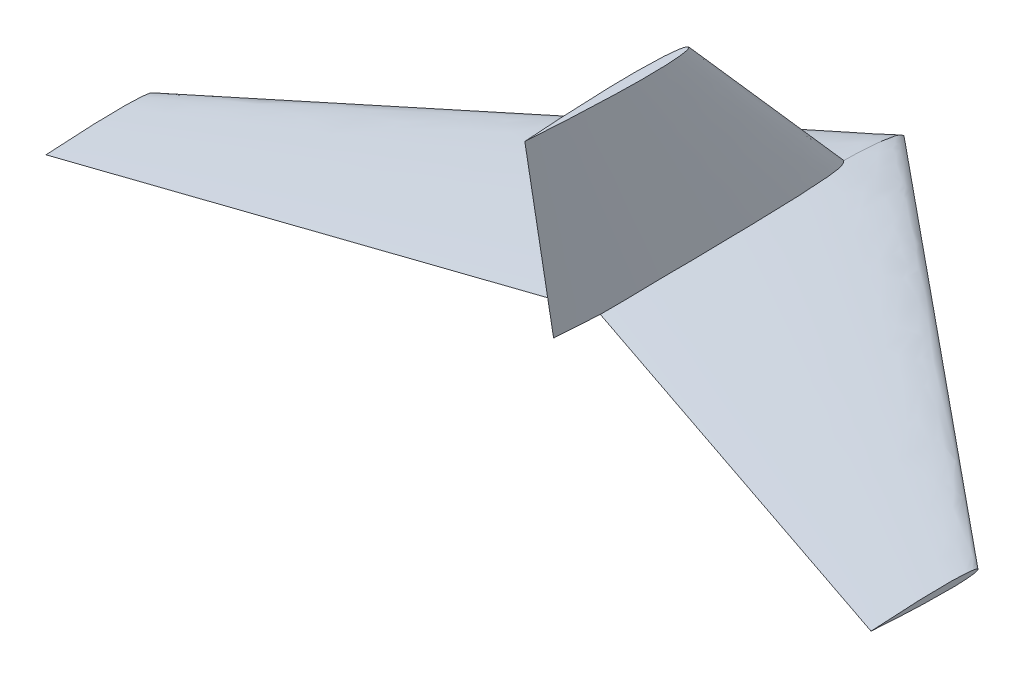
ISO-10303-21;
HEADER;
FILE_DESCRIPTION(('STEP AP214'),'2;1');
FILE_NAME('part.step','',(''),(''),'','','');
FILE_SCHEMA(('AUTOMOTIVE_DESIGN { 1 0 10303 214 1 1 1 1 }'));
ENDSEC;
DATA;
#1=APPLICATION_CONTEXT('core data for automotive mechanical design processes');
#2=APPLICATION_PROTOCOL_DEFINITION('international standard','automotive_design',2000,#1);
#3=PRODUCT_CONTEXT('',#1,'mechanical');
#4=PRODUCT('Part','Part','',(#3));
#5=PRODUCT_RELATED_PRODUCT_CATEGORY('part','',(#4));
#6=PRODUCT_DEFINITION_FORMATION('','',#4);
#7=PRODUCT_DEFINITION_CONTEXT('part definition',#1,'design');
#8=PRODUCT_DEFINITION('design','',#6,#7);
#9=PRODUCT_DEFINITION_SHAPE('','',#8);
#10=(LENGTH_UNIT() NAMED_UNIT(*) SI_UNIT(.MILLI.,.METRE.));
#11=(NAMED_UNIT(*) PLANE_ANGLE_UNIT() SI_UNIT($,.RADIAN.));
#12=(NAMED_UNIT(*) SI_UNIT($,.STERADIAN.) SOLID_ANGLE_UNIT());
#13=UNCERTAINTY_MEASURE_WITH_UNIT(LENGTH_MEASURE(1.E-05),#10,'distance_accuracy_value','');
#14=(GEOMETRIC_REPRESENTATION_CONTEXT(3) GLOBAL_UNCERTAINTY_ASSIGNED_CONTEXT((#13)) GLOBAL_UNIT_ASSIGNED_CONTEXT((#10,
#11,#12)) REPRESENTATION_CONTEXT('',''));
#15=CARTESIAN_POINT('',(0.,0.,0.));
#16=DIRECTION('',(0.,0.,1.));
#17=DIRECTION('',(1.,0.,0.));
#18=AXIS2_PLACEMENT_3D('',#15,#16,#17);
#19=CARTESIAN_POINT('',(90.2729964394559,0.,2285.86063175467));
#20=DIRECTION('',(0.,1.,0.));
#21=DIRECTION('',(0.,0.,1.));
#22=AXIS2_PLACEMENT_3D('',#19,#20,#21);
#23=PLANE('',#22);
#24=CARTESIAN_POINT('',(0.,0.,597.375777228107));
#25=CARTESIAN_POINT('',(24.4686857432572,0.,623.99082207803));
#26=CARTESIAN_POINT('',(48.0807674286761,0.,676.749943253216));
#27=CARTESIAN_POINT('',(58.4563941885563,0.,740.497070586776));
#28=CARTESIAN_POINT('',(67.0356181046043,0.,798.221641109859));
#29=CARTESIAN_POINT('',(71.6619113970218,0.,833.954531447695));
#30=CARTESIAN_POINT('',(76.7954611532741,0.,885.556528213105));
#31=CARTESIAN_POINT('',(78.7254432911088,0.,910.476862048081));
#32=CARTESIAN_POINT('',(84.9692734153363,0.,993.647536772071));
#33=CARTESIAN_POINT('',(89.4514630302663,0.,1059.05275127144));
#34=CARTESIAN_POINT('',(95.1214122712025,0.,1171.66484206801));
#35=CARTESIAN_POINT('',(97.0349702142618,0.,1224.59310122597));
#36=CARTESIAN_POINT('',(101.528355475328,0.,1386.08407254535));
#37=CARTESIAN_POINT('',(102.502084377375,0.,1500.16944808936));
#38=CARTESIAN_POINT('',(101.978691915586,0.,1839.41623870926));
#39=CARTESIAN_POINT('',(94.6250607128276,0.,2178.97783262625));
#40=CARTESIAN_POINT('',(66.4940356116456,0.,2970.17291405463));
#41=CARTESIAN_POINT('',(33.6189798191377,0.,3535.06648153273));
#42=CARTESIAN_POINT('',(0.,0.,3986.5467473708));
#43=B_SPLINE_CURVE_WITH_KNOTS('',3,(#24,#25,#26,#27,#28,#29,#30,#31,#32,#33,#34,#35,#36,#37,#38,
#39,#40,#41,#42),.UNSPECIFIED.,.F.,.F.,(4,1,1,1,1,1,1,1,1,1,1,1,1,1,1,1,4),(0.,
0.0297059101390745,0.0510978464013305,0.0565098822415303,0.0809910879672366,0.0828811165702095,
0.102210307338613,0.102991859394858,0.156309200171479,0.159955868882718,0.20230384136123,
0.202946576893144,0.3022274459203,0.302770782723327,0.501714656703684,0.601307692969157,1.),.UNSPECIFIED.);
#44=CARTESIAN_POINT('',(0.,0.,3986.5467473708));
#45=VERTEX_POINT('',#44);
#46=CARTESIAN_POINT('',(0.,0.,597.375777228107));
#47=VERTEX_POINT('',#46);
#48=EDGE_CURVE('E93',#45,#47,#43,.F.);
#49=ORIENTED_EDGE('',*,*,#48,.F.);
#50=CARTESIAN_POINT('',(0.,0.,3986.5467473708));
#51=CARTESIAN_POINT('',(-33.6189798191371,0.,3535.06648153273));
#52=CARTESIAN_POINT('',(-66.494035611645,0.,2970.17291405463));
#53=CARTESIAN_POINT('',(-94.6250607128273,0.,2178.97783262625));
#54=CARTESIAN_POINT('',(-101.978691915586,0.,1839.41623870926));
#55=CARTESIAN_POINT('',(-102.502084377375,0.,1500.16944808936));
#56=CARTESIAN_POINT('',(-101.528355475328,0.,1386.08407254535));
#57=CARTESIAN_POINT('',(-97.0349702142617,0.,1224.59310122597));
#58=CARTESIAN_POINT('',(-95.1214122712025,0.,1171.66484206801));
#59=CARTESIAN_POINT('',(-89.4514630302662,0.,1059.05275127144));
#60=CARTESIAN_POINT('',(-84.9692734153364,0.,993.647536772071));
#61=CARTESIAN_POINT('',(-78.7254432911088,0.,910.476862048081));
#62=CARTESIAN_POINT('',(-76.7954611532741,0.,885.556528213105));
#63=CARTESIAN_POINT('',(-71.6619113970218,0.,833.954531447696));
#64=CARTESIAN_POINT('',(-67.0356181046043,0.,798.221641109859));
#65=CARTESIAN_POINT('',(-58.4563941885563,0.,740.497070586776));
#66=CARTESIAN_POINT('',(-48.0807674286762,0.,676.749943253216));
#67=CARTESIAN_POINT('',(-24.4686857432572,0.,623.99082207803));
#68=CARTESIAN_POINT('',(0.,0.,597.375777228107));
#69=B_SPLINE_CURVE_WITH_KNOTS('',3,(#50,#51,#52,#53,#54,#55,#56,#57,#58,#59,#60,#61,#62,#63,#64,
#65,#66,#67,#68),.UNSPECIFIED.,.F.,.F.,(4,1,1,1,1,1,1,1,1,1,1,1,1,1,1,1,4),(0.,
0.398692307030843,0.498285343296316,0.697229217276673,0.6977725540797,0.797053423106856,
0.79769615863877,0.840044131117282,0.843690799828521,0.897008140605142,0.897789692661387,
0.917118883429791,0.919008912032763,0.94349011775847,0.948902153598669,0.970294089860925,1.),.UNSPECIFIED.);
#70=EDGE_CURVE('E57',#47,#45,#69,.F.);
#71=ORIENTED_EDGE('',*,*,#70,.F.);
#72=EDGE_LOOP('',(#49,#71));
#73=FACE_BOUND('',#72,.T.);
#74=ADVANCED_FACE('F54',(#73),#23,.F.);
#75=CARTESIAN_POINT('',(-48.8898918731191,2101.28600148847,3378.83049193071));
#76=DIRECTION('',(0.,1.,0.));
#77=DIRECTION('',(0.,0.,1.));
#78=AXIS2_PLACEMENT_3D('',#75,#76,#77);
#79=PLANE('',#78);
#80=CARTESIAN_POINT('',(2.42806059504421E-13,2101.28600148847,4314.03784312439));
#81=CARTESIAN_POINT('',(-19.7621296311033,2101.28600148847,4065.80710242259));
#82=CARTESIAN_POINT('',(-33.6740446262281,2101.28600148847,3755.12902816983));
#83=CARTESIAN_POINT('',(-51.6818402453677,2101.28600148847,3320.05202534931));
#84=CARTESIAN_POINT('',(-56.3377320598121,2101.28600148847,3133.3598826083));
#85=CARTESIAN_POINT('',(-55.3484267786284,2101.28600148847,2946.85839988676));
#86=CARTESIAN_POINT('',(-54.0712461712591,2101.28600148847,2884.14271080841));
#87=CARTESIAN_POINT('',(-52.1152651548754,2101.28600148847,2795.32871419486));
#88=CARTESIAN_POINT('',(-51.4442588545351,2101.28600148847,2766.21516842326));
#89=CARTESIAN_POINT('',(-48.5900962517415,2101.28600148847,2704.28698692276));
#90=CARTESIAN_POINT('',(-45.9489542789624,2101.28600148847,2668.32530078522));
#91=CARTESIAN_POINT('',(-42.1965171195406,2101.28600148847,2622.62021980684));
#92=CARTESIAN_POINT('',(-41.0221766265377,2101.28600148847,2608.92969775617));
#93=CARTESIAN_POINT('',(-38.1405574586165,2101.28600148847,2580.56590908626));
#94=CARTESIAN_POINT('',(-35.7480302967286,2101.28600148847,2560.89711015434));
#95=CARTESIAN_POINT('',(-31.0302559656767,2101.28600148847,2529.0995890966));
#96=CARTESIAN_POINT('',(-24.7481551305557,2101.28600148847,2494.22415028041));
#97=CARTESIAN_POINT('',(-15.5864154330689,2101.28600148847,2464.47214185311));
#98=CARTESIAN_POINT('',(0.,2101.28600148847,2449.99380954591));
#99=B_SPLINE_CURVE_WITH_KNOTS('',3,(#80,#81,#82,#83,#84,#85,#86,#87,#88,#89,#90,#91,#92,#93,#94,
#95,#96,#97,#98),.UNSPECIFIED.,.F.,.F.,(4,1,1,1,1,1,1,1,1,1,1,1,1,1,1,1,4),(0.,
0.398692307030843,0.498285343296316,0.697229217276673,0.6977725540797,0.797053423106856,
0.79769615863877,0.840044131117282,0.843690799828521,0.897008140605142,0.897789692661387,
0.917118883429791,0.919008912032763,0.94349011775847,0.948902153598669,0.970294089860925,1.),.UNSPECIFIED.);
#100=CARTESIAN_POINT('',(2.35675738952997E-13,2101.28600148847,4314.03784312439));
#101=VERTEX_POINT('',#100);
#102=CARTESIAN_POINT('',(0.,2101.28600148847,2449.99380954591));
#103=VERTEX_POINT('',#102);
#104=EDGE_CURVE('E12',#101,#103,#99,.T.);
#105=ORIENTED_EDGE('',*,*,#104,.F.);
#106=CARTESIAN_POINT('',(0.,2101.28600148847,2449.99380954591));
#107=CARTESIAN_POINT('',(15.5864154330689,2101.28600148847,2464.47214185311));
#108=CARTESIAN_POINT('',(24.7481551305557,2101.28600148847,2494.22415028041));
#109=CARTESIAN_POINT('',(31.0302559656768,2101.28600148847,2529.0995890966));
#110=CARTESIAN_POINT('',(35.7480302967286,2101.28600148847,2560.89711015434));
#111=CARTESIAN_POINT('',(38.1405574586166,2101.28600148847,2580.56590908626));
#112=CARTESIAN_POINT('',(41.0221766265378,2101.28600148847,2608.92969775617));
#113=CARTESIAN_POINT('',(42.1965171195406,2101.28600148847,2622.62021980684));
#114=CARTESIAN_POINT('',(45.9489542789624,2101.28600148847,2668.32530078522));
#115=CARTESIAN_POINT('',(48.5900962517416,2101.28600148847,2704.28698692276));
#116=CARTESIAN_POINT('',(51.4442588545352,2101.28600148847,2766.21516842326));
#117=CARTESIAN_POINT('',(52.1152651548755,2101.28600148847,2795.32871419485));
#118=CARTESIAN_POINT('',(54.0712461712592,2101.28600148847,2884.14271080841));
#119=CARTESIAN_POINT('',(55.3484267786286,2101.28600148847,2946.85839988676));
#120=CARTESIAN_POINT('',(56.3377320598122,2101.28600148847,3133.3598826083));
#121=CARTESIAN_POINT('',(51.6818402453679,2101.28600148847,3320.05202534931));
#122=CARTESIAN_POINT('',(33.6740446262285,2101.28600148847,3755.12902816983));
#123=CARTESIAN_POINT('',(19.7621296311037,2101.28600148847,4065.80710242259));
#124=CARTESIAN_POINT('',(2.35675738952997E-13,2101.28600148847,4314.03784312439));
#125=B_SPLINE_CURVE_WITH_KNOTS('',3,(#106,#107,#108,#109,#110,#111,#112,#113,#114,#115,#116,
#117,#118,#119,#120,#121,#122,#123,#124),.UNSPECIFIED.,.F.,.F.,(4,1,1,1,1,1,1,1,1,1,1,1,1,1,1,1,
4),(0.,0.0297059101390745,0.0510978464013305,0.0565098822415303,0.0809910879672366,
0.0828811165702095,0.102210307338613,0.102991859394858,0.156309200171479,0.159955868882718,
0.20230384136123,0.202946576893144,0.3022274459203,0.302770782723327,0.501714656703684,
0.601307692969157,1.),.UNSPECIFIED.);
#126=EDGE_CURVE('E79',#103,#101,#125,.T.);
#127=ORIENTED_EDGE('',*,*,#126,.F.);
#128=EDGE_LOOP('',(#105,#127));
#129=FACE_BOUND('',#128,.T.);
#130=ADVANCED_FACE('F80',(#129),#79,.T.);
#131=CARTESIAN_POINT('',(2.42806059504421E-13,2101.28600148847,4314.03784312439));
#132=CARTESIAN_POINT('',(0.,0.,3986.5467473708));
#133=CARTESIAN_POINT('',(-19.7621296311033,2101.28600148847,4065.80710242259));
#134=CARTESIAN_POINT('',(-33.6189798191371,0.,3535.06648153273));
#135=CARTESIAN_POINT('',(-33.6740446262281,2101.28600148847,3755.12902816983));
#136=CARTESIAN_POINT('',(-66.494035611645,0.,2970.17291405463));
#137=CARTESIAN_POINT('',(-51.6818402453677,2101.28600148847,3320.05202534931));
#138=CARTESIAN_POINT('',(-94.6250607128273,0.,2178.97783262625));
#139=CARTESIAN_POINT('',(-56.3377320598121,2101.28600148847,3133.3598826083));
#140=CARTESIAN_POINT('',(-101.978691915586,0.,1839.41623870926));
#141=CARTESIAN_POINT('',(-55.3484267786284,2101.28600148847,2946.85839988676));
#142=CARTESIAN_POINT('',(-102.502084377375,0.,1500.16944808936));
#143=CARTESIAN_POINT('',(-54.0712461712591,2101.28600148847,2884.14271080841));
#144=CARTESIAN_POINT('',(-101.528355475328,0.,1386.08407254535));
#145=CARTESIAN_POINT('',(-52.1152651548754,2101.28600148847,2795.32871419486));
#146=CARTESIAN_POINT('',(-97.0349702142617,0.,1224.59310122597));
#147=CARTESIAN_POINT('',(-51.4442588545351,2101.28600148847,2766.21516842326));
#148=CARTESIAN_POINT('',(-95.1214122712025,0.,1171.66484206801));
#149=CARTESIAN_POINT('',(-48.5900962517415,2101.28600148847,2704.28698692276));
#150=CARTESIAN_POINT('',(-89.4514630302662,0.,1059.05275127144));
#151=CARTESIAN_POINT('',(-45.9489542789624,2101.28600148847,2668.32530078522));
#152=CARTESIAN_POINT('',(-84.9692734153364,0.,993.647536772071));
#153=CARTESIAN_POINT('',(-42.1965171195406,2101.28600148847,2622.62021980684));
#154=CARTESIAN_POINT('',(-78.7254432911088,0.,910.476862048081));
#155=CARTESIAN_POINT('',(-41.0221766265377,2101.28600148847,2608.92969775617));
#156=CARTESIAN_POINT('',(-76.7954611532741,0.,885.556528213105));
#157=CARTESIAN_POINT('',(-38.1405574586165,2101.28600148847,2580.56590908626));
#158=CARTESIAN_POINT('',(-71.6619113970218,0.,833.954531447696));
#159=CARTESIAN_POINT('',(-35.7480302967286,2101.28600148847,2560.89711015434));
#160=CARTESIAN_POINT('',(-67.0356181046043,0.,798.221641109859));
#161=CARTESIAN_POINT('',(-31.0302559656767,2101.28600148847,2529.0995890966));
#162=CARTESIAN_POINT('',(-58.4563941885563,0.,740.497070586776));
#163=CARTESIAN_POINT('',(-24.7481551305557,2101.28600148847,2494.22415028041));
#164=CARTESIAN_POINT('',(-48.0807674286762,0.,676.749943253216));
#165=CARTESIAN_POINT('',(-15.5864154330689,2101.28600148847,2464.47214185311));
#166=CARTESIAN_POINT('',(-24.4686857432572,0.,623.99082207803));
#167=CARTESIAN_POINT('',(0.,2101.28600148847,2449.99380954591));
#168=CARTESIAN_POINT('',(0.,0.,597.375777228107));
#169=B_SPLINE_SURFACE_WITH_KNOTS('',3,1,((#131,#132),(#133,#134),(#135,#136),(#137,#138),(#139,
#140),(#141,#142),(#143,#144),(#145,#146),(#147,#148),(#149,#150),(#151,#152),(#153,#154),(#155,
#156),(#157,#158),(#159,#160),(#161,#162),(#163,#164),(#165,#166),(#167,#168)),.UNSPECIFIED.,
.F.,.F.,.F.,(4,1,1,1,1,1,1,1,1,1,1,1,1,1,1,1,4),(2,2),(0.,0.398692307030843,0.498285343296316,
0.697229217276673,0.6977725540797,0.797053423106856,0.79769615863877,0.840044131117282,
0.843690799828521,0.897008140605142,0.897789692661387,0.917118883429791,0.919008912032763,
0.94349011775847,0.948902153598669,0.970294089860925,1.),(0.,1.),.UNSPECIFIED.);
#170=DIRECTION('',(0.,0.750095977904658,0.661328983132642));
#171=VECTOR('',#170,1.);
#172=CARTESIAN_POINT('',(0.,1050.64300074423,1523.68479338701));
#173=LINE('',#172,#171);
#174=EDGE_CURVE('E91',#47,#103,#173,.T.);
#175=DIRECTION('',(0.,-0.988071835346757,-0.153993662838735));
#176=VECTOR('',#175,1.);
#177=CARTESIAN_POINT('',(1.15064911722157E-13,1050.64300074423,4150.29229524759));
#178=LINE('',#177,#176);
#179=EDGE_CURVE('E86',#101,#45,#178,.T.);
#180=ORIENTED_EDGE('',*,*,#104,.T.);
#181=ORIENTED_EDGE('',*,*,#174,.F.);
#182=ORIENTED_EDGE('',*,*,#70,.T.);
#183=ORIENTED_EDGE('',*,*,#179,.F.);
#184=EDGE_LOOP('',(#180,#181,#182,#183));
#185=FACE_BOUND('',#184,.T.);
#186=ADVANCED_FACE('F90',(#185),#169,.T.);
#187=CARTESIAN_POINT('',(0.,2101.28600148847,2449.99380954591));
#188=CARTESIAN_POINT('',(0.,0.,597.375777228107));
#189=CARTESIAN_POINT('',(15.5864154330689,2101.28600148847,2464.47214185311));
#190=CARTESIAN_POINT('',(24.4686857432572,0.,623.99082207803));
#191=CARTESIAN_POINT('',(24.7481551305557,2101.28600148847,2494.22415028041));
#192=CARTESIAN_POINT('',(48.0807674286761,0.,676.749943253216));
#193=CARTESIAN_POINT('',(31.0302559656768,2101.28600148847,2529.0995890966));
#194=CARTESIAN_POINT('',(58.4563941885563,0.,740.497070586776));
#195=CARTESIAN_POINT('',(35.7480302967286,2101.28600148847,2560.89711015434));
#196=CARTESIAN_POINT('',(67.0356181046043,0.,798.221641109859));
#197=CARTESIAN_POINT('',(38.1405574586166,2101.28600148847,2580.56590908626));
#198=CARTESIAN_POINT('',(71.6619113970218,0.,833.954531447695));
#199=CARTESIAN_POINT('',(41.0221766265378,2101.28600148847,2608.92969775617));
#200=CARTESIAN_POINT('',(76.7954611532741,0.,885.556528213105));
#201=CARTESIAN_POINT('',(42.1965171195406,2101.28600148847,2622.62021980684));
#202=CARTESIAN_POINT('',(78.7254432911088,0.,910.476862048081));
#203=CARTESIAN_POINT('',(45.9489542789624,2101.28600148847,2668.32530078522));
#204=CARTESIAN_POINT('',(84.9692734153363,0.,993.647536772071));
#205=CARTESIAN_POINT('',(48.5900962517416,2101.28600148847,2704.28698692276));
#206=CARTESIAN_POINT('',(89.4514630302663,0.,1059.05275127144));
#207=CARTESIAN_POINT('',(51.4442588545352,2101.28600148847,2766.21516842326));
#208=CARTESIAN_POINT('',(95.1214122712025,0.,1171.66484206801));
#209=CARTESIAN_POINT('',(52.1152651548755,2101.28600148847,2795.32871419485));
#210=CARTESIAN_POINT('',(97.0349702142618,0.,1224.59310122597));
#211=CARTESIAN_POINT('',(54.0712461712592,2101.28600148847,2884.14271080841));
#212=CARTESIAN_POINT('',(101.528355475328,0.,1386.08407254535));
#213=CARTESIAN_POINT('',(55.3484267786286,2101.28600148847,2946.85839988676));
#214=CARTESIAN_POINT('',(102.502084377375,0.,1500.16944808936));
#215=CARTESIAN_POINT('',(56.3377320598122,2101.28600148847,3133.3598826083));
#216=CARTESIAN_POINT('',(101.978691915586,0.,1839.41623870926));
#217=CARTESIAN_POINT('',(51.6818402453679,2101.28600148847,3320.05202534931));
#218=CARTESIAN_POINT('',(94.6250607128276,0.,2178.97783262625));
#219=CARTESIAN_POINT('',(33.6740446262285,2101.28600148847,3755.12902816983));
#220=CARTESIAN_POINT('',(66.4940356116456,0.,2970.17291405463));
#221=CARTESIAN_POINT('',(19.7621296311037,2101.28600148847,4065.80710242259));
#222=CARTESIAN_POINT('',(33.6189798191377,0.,3535.06648153273));
#223=CARTESIAN_POINT('',(2.35675738952997E-13,2101.28600148847,4314.03784312439));
#224=CARTESIAN_POINT('',(0.,0.,3986.5467473708));
#225=B_SPLINE_SURFACE_WITH_KNOTS('',3,1,((#187,#188),(#189,#190),(#191,#192),(#193,#194),(#195,
#196),(#197,#198),(#199,#200),(#201,#202),(#203,#204),(#205,#206),(#207,#208),(#209,#210),(#211,
#212),(#213,#214),(#215,#216),(#217,#218),(#219,#220),(#221,#222),(#223,#224)),.UNSPECIFIED.,
.F.,.F.,.F.,(4,1,1,1,1,1,1,1,1,1,1,1,1,1,1,1,4),(2,2),(0.,0.0297059101390745,0.0510978464013305,
0.0565098822415303,0.0809910879672366,0.0828811165702095,0.102210307338613,0.102991859394858,
0.156309200171479,0.159955868882718,0.20230384136123,0.202946576893144,0.3022274459203,
0.302770782723327,0.501714656703684,0.601307692969157,1.),(0.,1.),.UNSPECIFIED.);
#226=ORIENTED_EDGE('',*,*,#126,.T.);
#227=ORIENTED_EDGE('',*,*,#179,.T.);
#228=ORIENTED_EDGE('',*,*,#48,.T.);
#229=ORIENTED_EDGE('',*,*,#174,.T.);
#230=EDGE_LOOP('',(#226,#227,#228,#229));
#231=FACE_BOUND('',#230,.T.);
#232=ADVANCED_FACE('F92',(#231),#225,.T.);
#233=CLOSED_SHELL('',(#74,#130,#186,#232));
#234=MANIFOLD_SOLID_BREP('B2',#233);
#235=CARTESIAN_POINT('',(4693.46783112089,31.7539411687443,4457.62384206853));
#236=DIRECTION('',(-1.,0.,0.));
#237=DIRECTION('',(0.,0.,-1.));
#238=AXIS2_PLACEMENT_3D('',#235,#236,#237);
#239=PLANE('',#238);
#240=CARTESIAN_POINT('',(4693.46783112089,0.,5068.18101010264));
#241=CARTESIAN_POINT('',(4693.46783112089,7.77630394893137,4946.61648277807));
#242=CARTESIAN_POINT('',(4693.46783112089,20.6544430765983,4743.92680011725));
#243=CARTESIAN_POINT('',(4693.46783112089,29.3294135208782,4540.98820348115));
#244=CARTESIAN_POINT('',(4693.46783112089,34.0447324452484,4378.87544846776));
#245=CARTESIAN_POINT('',(4693.46783112089,35.303120181987,4297.61777260393));
#246=CARTESIAN_POINT('',(4693.46783112089,35.9280991502211,4175.93359964368));
#247=CARTESIAN_POINT('',(4693.46783112089,35.9186303596776,4135.16003583177));
#248=CARTESIAN_POINT('',(4693.46783112089,34.0805457315542,4075.649631855));
#249=CARTESIAN_POINT('',(4693.46783112089,33.1149731008769,4054.35207556255));
#250=CARTESIAN_POINT('',(4693.46783112089,30.878922525523,4013.69263756886));
#251=CARTESIAN_POINT('',(4693.46783112089,29.4603488477498,3991.98046962838));
#252=CARTESIAN_POINT('',(4693.46783112089,27.206467979055,3963.27179040754));
#253=CARTESIAN_POINT('',(4693.46783112089,26.3737551563035,3953.47440469531));
#254=CARTESIAN_POINT('',(4693.46783112089,24.2675965609117,3934.52120797839));
#255=CARTESIAN_POINT('',(4693.46783112089,22.8047976334664,3923.9913623644));
#256=CARTESIAN_POINT('',(4693.46783112089,18.603899124728,3891.82666133037));
#257=CARTESIAN_POINT('',(4693.46783112089,16.1286906767673,3868.38231381511));
#258=CARTESIAN_POINT('',(4693.46783112089,0.,3851.35601684908));
#259=B_SPLINE_CURVE_WITH_KNOTS('',3,(#240,#241,#242,#243,#244,#245,#246,#247,#248,#249,#250,
#251,#252,#253,#254,#255,#256,#257,#258),.UNSPECIFIED.,.F.,.F.,(4,1,1,1,1,1,1,1,1,1,1,1,1,1,1,1,
4),(0.,0.298931815970666,0.498152968932555,0.498299211220126,0.696834066796417,
0.697522121171649,0.796796462208501,0.796844070583475,0.843589068570304,0.849087559843308,
0.896763932817385,0.896989321780881,0.919683005075993,0.920855221312246,0.943853286653914,
0.945874325951042,1.),.UNSPECIFIED.);
#260=CARTESIAN_POINT('',(4693.46783112089,0.,3851.35601684908));
#261=VERTEX_POINT('',#260);
#262=CARTESIAN_POINT('',(4693.46783112089,0.,5068.18101010264));
#263=VERTEX_POINT('',#262);
#264=EDGE_CURVE('E232',#261,#263,#259,.F.);
#265=ORIENTED_EDGE('',*,*,#264,.T.);
#266=CARTESIAN_POINT('',(4693.46783112089,0.,3851.35601684908));
#267=CARTESIAN_POINT('',(4693.46783112089,-16.1286906767668,3868.38231381511));
#268=CARTESIAN_POINT('',(4693.46783112089,-18.6038991247277,3891.82666133037));
#269=CARTESIAN_POINT('',(4693.46783112089,-22.804797633466,3923.9913623644));
#270=CARTESIAN_POINT('',(4693.46783112089,-24.2675965609114,3934.52120797839));
#271=CARTESIAN_POINT('',(4693.46783112089,-26.3737551563032,3953.47440469531));
#272=CARTESIAN_POINT('',(4693.46783112089,-27.2064679790546,3963.27179040754));
#273=CARTESIAN_POINT('',(4693.46783112089,-29.4603488477494,3991.98046962839));
#274=CARTESIAN_POINT('',(4693.46783112089,-30.8789225255227,4013.69263756886));
#275=CARTESIAN_POINT('',(4693.46783112089,-33.1149731008765,4054.35207556255));
#276=CARTESIAN_POINT('',(4693.46783112089,-34.0805457315539,4075.649631855));
#277=CARTESIAN_POINT('',(4693.46783112089,-35.9186303596773,4135.16003583177));
#278=CARTESIAN_POINT('',(4693.46783112089,-35.9280991502208,4175.93359964368));
#279=CARTESIAN_POINT('',(4693.46783112089,-35.3031201819867,4297.61777260393));
#280=CARTESIAN_POINT('',(4693.46783112089,-34.0447324452481,4378.87544846776));
#281=CARTESIAN_POINT('',(4693.46783112089,-29.329413520878,4540.98820348115));
#282=CARTESIAN_POINT('',(4693.46783112089,-20.6544430765981,4743.92680011725));
#283=CARTESIAN_POINT('',(4693.46783112089,-7.77630394893124,4946.61648277807));
#284=CARTESIAN_POINT('',(4693.46783112089,0.,5068.18101010264));
#285=B_SPLINE_CURVE_WITH_KNOTS('',3,(#266,#267,#268,#269,#270,#271,#272,#273,#274,#275,#276,
#277,#278,#279,#280,#281,#282,#283,#284),.UNSPECIFIED.,.F.,.F.,(4,1,1,1,1,1,1,1,1,1,1,1,1,1,1,1,
4),(0.,0.0541256740489575,0.0561467133460857,0.0791447786877543,0.0803169949240068,
0.103010678219119,0.103236067182615,0.150912440156692,0.156410931429696,0.203155929416525,
0.203203537791499,0.302477878828351,0.303165933203583,0.501700788779874,0.501847031067445,
0.701068184029334,1.),.UNSPECIFIED.);
#286=EDGE_CURVE('E263',#263,#261,#285,.F.);
#287=ORIENTED_EDGE('',*,*,#286,.T.);
#288=EDGE_LOOP('',(#265,#287));
#289=FACE_BOUND('',#288,.T.);
#290=ADVANCED_FACE('F229',(#289),#239,.F.);
#291=CARTESIAN_POINT('',(-4693.46783112089,31.7539411687443,4457.62384206853));
#292=DIRECTION('',(1.,0.,0.));
#293=DIRECTION('',(0.,0.,-1.));
#294=AXIS2_PLACEMENT_3D('',#291,#292,#293);
#295=PLANE('',#294);
#296=CARTESIAN_POINT('',(-4693.46783112089,0.,5068.18101010264));
#297=CARTESIAN_POINT('',(-4693.46783112089,7.77630394893137,4946.61648277807));
#298=CARTESIAN_POINT('',(-4693.46783112089,20.6544430765983,4743.92680011725));
#299=CARTESIAN_POINT('',(-4693.46783112089,29.3294135208782,4540.98820348115));
#300=CARTESIAN_POINT('',(-4693.46783112089,34.0447324452484,4378.87544846776));
#301=CARTESIAN_POINT('',(-4693.46783112089,35.303120181987,4297.61777260393));
#302=CARTESIAN_POINT('',(-4693.46783112089,35.9280991502211,4175.93359964368));
#303=CARTESIAN_POINT('',(-4693.46783112089,35.9186303596776,4135.16003583177));
#304=CARTESIAN_POINT('',(-4693.46783112089,34.0805457315542,4075.649631855));
#305=CARTESIAN_POINT('',(-4693.46783112089,33.1149731008769,4054.35207556255));
#306=CARTESIAN_POINT('',(-4693.46783112089,30.878922525523,4013.69263756886));
#307=CARTESIAN_POINT('',(-4693.46783112089,29.4603488477498,3991.98046962838));
#308=CARTESIAN_POINT('',(-4693.46783112089,27.206467979055,3963.27179040754));
#309=CARTESIAN_POINT('',(-4693.46783112089,26.3737551563035,3953.47440469531));
#310=CARTESIAN_POINT('',(-4693.46783112089,24.2675965609117,3934.52120797839));
#311=CARTESIAN_POINT('',(-4693.46783112089,22.8047976334664,3923.9913623644));
#312=CARTESIAN_POINT('',(-4693.46783112089,18.603899124728,3891.82666133037));
#313=CARTESIAN_POINT('',(-4693.46783112089,16.1286906767673,3868.38231381511));
#314=CARTESIAN_POINT('',(-4693.46783112089,0.,3851.35601684908));
#315=B_SPLINE_CURVE_WITH_KNOTS('',3,(#296,#297,#298,#299,#300,#301,#302,#303,#304,#305,#306,
#307,#308,#309,#310,#311,#312,#313,#314),.UNSPECIFIED.,.F.,.F.,(4,1,1,1,1,1,1,1,1,1,1,1,1,1,1,1,
4),(0.,0.298931815970666,0.498152968932555,0.498299211220126,0.696834066796417,
0.697522121171649,0.796796462208501,0.796844070583475,0.843589068570304,0.849087559843308,
0.896763932817385,0.896989321780881,0.919683005075993,0.920855221312246,0.943853286653914,
0.945874325951042,1.),.UNSPECIFIED.);
#316=CARTESIAN_POINT('',(-4693.46783112089,0.,3851.35601684908));
#317=VERTEX_POINT('',#316);
#318=CARTESIAN_POINT('',(-4693.46783112089,0.,5068.18101010264));
#319=VERTEX_POINT('',#318);
#320=EDGE_CURVE('E241',#317,#319,#315,.F.);
#321=ORIENTED_EDGE('',*,*,#320,.F.);
#322=CARTESIAN_POINT('',(-4693.46783112089,0.,3851.35601684908));
#323=CARTESIAN_POINT('',(-4693.46783112089,-16.1286906767668,3868.38231381511));
#324=CARTESIAN_POINT('',(-4693.46783112089,-18.6038991247277,3891.82666133037));
#325=CARTESIAN_POINT('',(-4693.46783112089,-22.804797633466,3923.9913623644));
#326=CARTESIAN_POINT('',(-4693.46783112089,-24.2675965609114,3934.52120797839));
#327=CARTESIAN_POINT('',(-4693.46783112089,-26.3737551563032,3953.47440469531));
#328=CARTESIAN_POINT('',(-4693.46783112089,-27.2064679790546,3963.27179040754));
#329=CARTESIAN_POINT('',(-4693.46783112089,-29.4603488477494,3991.98046962839));
#330=CARTESIAN_POINT('',(-4693.46783112089,-30.8789225255227,4013.69263756886));
#331=CARTESIAN_POINT('',(-4693.46783112089,-33.1149731008765,4054.35207556255));
#332=CARTESIAN_POINT('',(-4693.46783112089,-34.0805457315539,4075.649631855));
#333=CARTESIAN_POINT('',(-4693.46783112089,-35.9186303596773,4135.16003583177));
#334=CARTESIAN_POINT('',(-4693.46783112089,-35.9280991502208,4175.93359964368));
#335=CARTESIAN_POINT('',(-4693.46783112089,-35.3031201819867,4297.61777260393));
#336=CARTESIAN_POINT('',(-4693.46783112089,-34.0447324452481,4378.87544846776));
#337=CARTESIAN_POINT('',(-4693.46783112089,-29.329413520878,4540.98820348115));
#338=CARTESIAN_POINT('',(-4693.46783112089,-20.6544430765981,4743.92680011725));
#339=CARTESIAN_POINT('',(-4693.46783112089,-7.77630394893124,4946.61648277807));
#340=CARTESIAN_POINT('',(-4693.46783112089,0.,5068.18101010264));
#341=B_SPLINE_CURVE_WITH_KNOTS('',3,(#322,#323,#324,#325,#326,#327,#328,#329,#330,#331,#332,
#333,#334,#335,#336,#337,#338,#339,#340),.UNSPECIFIED.,.F.,.F.,(4,1,1,1,1,1,1,1,1,1,1,1,1,1,1,1,
4),(0.,0.0541256740489575,0.0561467133460857,0.0791447786877543,0.0803169949240068,
0.103010678219119,0.103236067182615,0.150912440156692,0.156410931429696,0.203155929416525,
0.203203537791499,0.302477878828351,0.303165933203583,0.501700788779874,0.501847031067445,
0.701068184029334,1.),.UNSPECIFIED.);
#342=EDGE_CURVE('E301',#319,#317,#341,.F.);
#343=ORIENTED_EDGE('',*,*,#342,.F.);
#344=EDGE_LOOP('',(#321,#343));
#345=FACE_BOUND('',#344,.T.);
#346=ADVANCED_FACE('F355',(#345),#295,.F.);
#347=CARTESIAN_POINT('',(0.,-4.27995099310006E-13,3476.64283786733));
#348=CARTESIAN_POINT('',(4693.46783112089,0.,5068.18101010264));
#349=CARTESIAN_POINT('',(0.,26.7711615087917,3129.49656029607));
#350=CARTESIAN_POINT('',(4693.46783112089,7.77630394893137,4946.61648277807));
#351=CARTESIAN_POINT('',(0.,61.355795518369,2550.23687686187));
#352=CARTESIAN_POINT('',(4693.46783112089,20.6544430765983,4743.92680011725));
#353=CARTESIAN_POINT('',(0.,85.9664181941947,1970.40101435516));
#354=CARTESIAN_POINT('',(4693.46783112089,29.3294135208782,4540.98820348115));
#355=CARTESIAN_POINT('',(0.,101.000303741431,1507.13669956477));
#356=CARTESIAN_POINT('',(4693.46783112089,34.0447324452484,4378.87544846776));
#357=CARTESIAN_POINT('',(0.,106.226527815227,1274.89129425779));
#358=CARTESIAN_POINT('',(4693.46783112089,35.303120181987,4297.61777260393));
#359=CARTESIAN_POINT('',(0.,104.578190611941,927.280286556629));
#360=CARTESIAN_POINT('',(4693.46783112089,35.9280991502211,4175.93359964368));
#361=CARTESIAN_POINT('',(0.,102.429875859536,810.833440108516));
#362=CARTESIAN_POINT('',(4693.46783112089,35.9186303596776,4135.16003583177));
#363=CARTESIAN_POINT('',(0.,99.4494379583022,640.668080900426));
#364=CARTESIAN_POINT('',(4693.46783112089,34.0805457315542,4075.649631855));
#365=CARTESIAN_POINT('',(0.,98.409176457216,579.734365907088));
#366=CARTESIAN_POINT('',(4693.46783112089,33.1149731008769,4054.35207556255));
#367=CARTESIAN_POINT('',(0.,92.1041823430915,463.573503947371));
#368=CARTESIAN_POINT('',(4693.46783112089,30.878922525523,4013.69263756886));
#369=CARTESIAN_POINT('',(0.,86.1063279802791,401.662043167843));
#370=CARTESIAN_POINT('',(4693.46783112089,29.4603488477498,3991.98046962838));
#371=CARTESIAN_POINT('',(0.,80.3401283380996,319.578190629788));
#372=CARTESIAN_POINT('',(4693.46783112089,27.206467979055,3963.27179040754));
#373=CARTESIAN_POINT('',(0.,78.7296210481302,291.527427089065));
#374=CARTESIAN_POINT('',(4693.46783112089,26.3737551563035,3953.47440469531));
#375=CARTESIAN_POINT('',(0.,72.8329881706712,237.346339555418));
#376=CARTESIAN_POINT('',(4693.46783112089,24.2675965609117,3934.52120797839));
#377=CARTESIAN_POINT('',(0.,68.0619271142303,207.262411796879));
#378=CARTESIAN_POINT('',(4693.46783112089,22.8047976334664,3923.9913623644));
#379=CARTESIAN_POINT('',(0.,54.4764173453133,115.670113991505));
#380=CARTESIAN_POINT('',(4693.46783112089,18.603899124728,3891.82666133037));
#381=CARTESIAN_POINT('',(0.,44.745186116507,50.1461157888759));
#382=CARTESIAN_POINT('',(4693.46783112089,16.1286906767673,3868.38231381511));
#383=CARTESIAN_POINT('',(0.,0.,0.));
#384=CARTESIAN_POINT('',(4693.46783112089,0.,3851.35601684908));
#385=B_SPLINE_SURFACE_WITH_KNOTS('',3,1,((#347,#348),(#349,#350),(#351,#352),(#353,#354),(#355,
#356),(#357,#358),(#359,#360),(#361,#362),(#363,#364),(#365,#366),(#367,#368),(#369,#370),(#371,
#372),(#373,#374),(#375,#376),(#377,#378),(#379,#380),(#381,#382),(#383,#384)),.UNSPECIFIED.,
.F.,.F.,.F.,(4,1,1,1,1,1,1,1,1,1,1,1,1,1,1,1,4),(2,2),(0.,0.298931815970666,0.498152968932555,
0.498299211220126,0.696834066796417,0.697522121171649,0.796796462208501,0.796844070583475,
0.843589068570304,0.849087559843308,0.896763932817385,0.896989321780881,0.919683005075993,
0.920855221312246,0.943853286653914,0.945874325951042,1.),(0.,1.),.UNSPECIFIED.);
#386=CARTESIAN_POINT('',(0.,-4.27995099310006E-13,3476.64283786733));
#387=CARTESIAN_POINT('',(0.,26.7711615087917,3129.49656029607));
#388=CARTESIAN_POINT('',(0.,61.355795518369,2550.23687686187));
#389=CARTESIAN_POINT('',(0.,85.9664181941947,1970.40101435516));
#390=CARTESIAN_POINT('',(0.,101.000303741431,1507.13669956477));
#391=CARTESIAN_POINT('',(0.,106.226527815227,1274.89129425779));
#392=CARTESIAN_POINT('',(0.,104.578190611941,927.280286556629));
#393=CARTESIAN_POINT('',(0.,102.429875859536,810.833440108516));
#394=CARTESIAN_POINT('',(0.,99.4494379583022,640.668080900426));
#395=CARTESIAN_POINT('',(0.,98.409176457216,579.734365907088));
#396=CARTESIAN_POINT('',(0.,92.1041823430915,463.573503947371));
#397=CARTESIAN_POINT('',(0.,86.1063279802791,401.662043167843));
#398=CARTESIAN_POINT('',(0.,80.3401283380996,319.578190629788));
#399=CARTESIAN_POINT('',(0.,78.7296210481302,291.527427089065));
#400=CARTESIAN_POINT('',(0.,72.8329881706712,237.346339555418));
#401=CARTESIAN_POINT('',(0.,68.0619271142303,207.262411796879));
#402=CARTESIAN_POINT('',(0.,54.4764173453133,115.670113991505));
#403=CARTESIAN_POINT('',(0.,44.745186116507,50.1461157888759));
#404=CARTESIAN_POINT('',(0.,0.,0.));
#405=B_SPLINE_CURVE_WITH_KNOTS('',3,(#386,#387,#388,#389,#390,#391,#392,#393,#394,#395,#396,
#397,#398,#399,#400,#401,#402,#403,#404),.UNSPECIFIED.,.F.,.F.,(4,1,1,1,1,1,1,1,1,1,1,1,1,1,1,1,
4),(0.,0.298931815970666,0.498152968932555,0.498299211220126,0.696834066796417,
0.697522121171649,0.796796462208501,0.796844070583475,0.843589068570304,0.849087559843308,
0.896763932817385,0.896989321780881,0.919683005075993,0.920855221312246,0.943853286653914,
0.945874325951042,1.),.UNSPECIFIED.);
#406=CARTESIAN_POINT('',(0.,-4.23536805324553E-13,3476.64283786733));
#407=VERTEX_POINT('',#406);
#408=CARTESIAN_POINT('',(0.,0.,0.));
#409=VERTEX_POINT('',#408);
#410=EDGE_CURVE('E191',#407,#409,#405,.T.);
#411=DIRECTION('',(0.947033228842652,0.,0.321135584244195));
#412=VECTOR('',#411,1.);
#413=CARTESIAN_POINT('',(2346.73391556045,-1.88684398023383E-13,4272.41192398498));
#414=LINE('',#413,#412);
#415=EDGE_CURVE('E268',#407,#263,#414,.T.);
#416=DIRECTION('',(-0.773048696155328,0.,-0.634346682321699));
#417=VECTOR('',#416,1.);
#418=CARTESIAN_POINT('',(2346.73391556045,0.,1925.67800842454));
#419=LINE('',#418,#417);
#420=EDGE_CURVE('E269',#261,#409,#419,.T.);
#421=ORIENTED_EDGE('',*,*,#410,.F.);
#422=ORIENTED_EDGE('',*,*,#415,.T.);
#423=ORIENTED_EDGE('',*,*,#264,.F.);
#424=ORIENTED_EDGE('',*,*,#420,.T.);
#425=EDGE_LOOP('',(#421,#422,#423,#424));
#426=FACE_BOUND('',#425,.T.);
#427=ADVANCED_FACE('F274',(#426),#385,.F.);
#428=CARTESIAN_POINT('',(0.,0.,0.));
#429=CARTESIAN_POINT('',(4693.46783112089,0.,3851.35601684908));
#430=CARTESIAN_POINT('',(0.,-44.7451861165069,50.1461157888758));
#431=CARTESIAN_POINT('',(4693.46783112089,-16.1286906767668,3868.38231381511));
#432=CARTESIAN_POINT('',(0.,-54.4764173453134,115.670113991505));
#433=CARTESIAN_POINT('',(4693.46783112089,-18.6038991247277,3891.82666133037));
#434=CARTESIAN_POINT('',(0.,-68.0619271142303,207.262411796879));
#435=CARTESIAN_POINT('',(4693.46783112089,-22.804797633466,3923.9913623644));
#436=CARTESIAN_POINT('',(0.,-72.8329881706712,237.346339555417));
#437=CARTESIAN_POINT('',(4693.46783112089,-24.2675965609114,3934.52120797839));
#438=CARTESIAN_POINT('',(0.,-78.7296210481303,291.527427089065));
#439=CARTESIAN_POINT('',(4693.46783112089,-26.3737551563032,3953.47440469531));
#440=CARTESIAN_POINT('',(0.,-80.3401283380997,319.578190629788));
#441=CARTESIAN_POINT('',(4693.46783112089,-27.2064679790546,3963.27179040754));
#442=CARTESIAN_POINT('',(0.,-86.1063279802792,401.662043167843));
#443=CARTESIAN_POINT('',(4693.46783112089,-29.4603488477494,3991.98046962839));
#444=CARTESIAN_POINT('',(0.,-92.1041823430916,463.57350394737));
#445=CARTESIAN_POINT('',(4693.46783112089,-30.8789225255227,4013.69263756886));
#446=CARTESIAN_POINT('',(0.,-98.4091764572161,579.734365907088));
#447=CARTESIAN_POINT('',(4693.46783112089,-33.1149731008765,4054.35207556255));
#448=CARTESIAN_POINT('',(0.,-99.4494379583023,640.668080900426));
#449=CARTESIAN_POINT('',(4693.46783112089,-34.0805457315539,4075.649631855));
#450=CARTESIAN_POINT('',(0.,-102.429875859536,810.833440108516));
#451=CARTESIAN_POINT('',(4693.46783112089,-35.9186303596773,4135.16003583177));
#452=CARTESIAN_POINT('',(0.,-104.578190611941,927.280286556629));
#453=CARTESIAN_POINT('',(4693.46783112089,-35.9280991502208,4175.93359964368));
#454=CARTESIAN_POINT('',(0.,-106.226527815228,1274.89129425779));
#455=CARTESIAN_POINT('',(4693.46783112089,-35.3031201819867,4297.61777260393));
#456=CARTESIAN_POINT('',(0.,-101.000303741431,1507.13669956477));
#457=CARTESIAN_POINT('',(4693.46783112089,-34.0447324452481,4378.87544846776));
#458=CARTESIAN_POINT('',(0.,-85.9664181941952,1970.40101435516));
#459=CARTESIAN_POINT('',(4693.46783112089,-29.329413520878,4540.98820348115));
#460=CARTESIAN_POINT('',(0.,-61.3557955183697,2550.23687686187));
#461=CARTESIAN_POINT('',(4693.46783112089,-20.6544430765981,4743.92680011725));
#462=CARTESIAN_POINT('',(0.,-26.7711615087924,3129.49656029607));
#463=CARTESIAN_POINT('',(4693.46783112089,-7.77630394893124,4946.61648277807));
#464=CARTESIAN_POINT('',(0.,-4.23536805324553E-13,3476.64283786733));
#465=CARTESIAN_POINT('',(4693.46783112089,0.,5068.18101010264));
#466=B_SPLINE_SURFACE_WITH_KNOTS('',3,1,((#428,#429),(#430,#431),(#432,#433),(#434,#435),(#436,
#437),(#438,#439),(#440,#441),(#442,#443),(#444,#445),(#446,#447),(#448,#449),(#450,#451),(#452,
#453),(#454,#455),(#456,#457),(#458,#459),(#460,#461),(#462,#463),(#464,#465)),.UNSPECIFIED.,
.F.,.F.,.F.,(4,1,1,1,1,1,1,1,1,1,1,1,1,1,1,1,4),(2,2),(0.,0.0541256740489575,0.0561467133460857,
0.0791447786877543,0.0803169949240068,0.103010678219119,0.103236067182615,0.150912440156692,
0.156410931429696,0.203155929416525,0.203203537791499,0.302477878828351,0.303165933203583,
0.501700788779874,0.501847031067445,0.701068184029334,1.),(0.,1.),.UNSPECIFIED.);
#467=CARTESIAN_POINT('',(0.,0.,0.));
#468=CARTESIAN_POINT('',(0.,-44.7451861165069,50.1461157888758));
#469=CARTESIAN_POINT('',(0.,-54.4764173453134,115.670113991505));
#470=CARTESIAN_POINT('',(0.,-68.0619271142303,207.262411796879));
#471=CARTESIAN_POINT('',(0.,-72.8329881706712,237.346339555417));
#472=CARTESIAN_POINT('',(0.,-78.7296210481303,291.527427089065));
#473=CARTESIAN_POINT('',(0.,-80.3401283380997,319.578190629788));
#474=CARTESIAN_POINT('',(0.,-86.1063279802792,401.662043167843));
#475=CARTESIAN_POINT('',(0.,-92.1041823430916,463.57350394737));
#476=CARTESIAN_POINT('',(0.,-98.4091764572161,579.734365907088));
#477=CARTESIAN_POINT('',(0.,-99.4494379583023,640.668080900426));
#478=CARTESIAN_POINT('',(0.,-102.429875859536,810.833440108516));
#479=CARTESIAN_POINT('',(0.,-104.578190611941,927.280286556629));
#480=CARTESIAN_POINT('',(0.,-106.226527815228,1274.89129425779));
#481=CARTESIAN_POINT('',(0.,-101.000303741431,1507.13669956477));
#482=CARTESIAN_POINT('',(0.,-85.9664181941952,1970.40101435516));
#483=CARTESIAN_POINT('',(0.,-61.3557955183697,2550.23687686187));
#484=CARTESIAN_POINT('',(0.,-26.7711615087924,3129.49656029607));
#485=CARTESIAN_POINT('',(0.,-4.23536805324553E-13,3476.64283786733));
#486=B_SPLINE_CURVE_WITH_KNOTS('',3,(#467,#468,#469,#470,#471,#472,#473,#474,#475,#476,#477,
#478,#479,#480,#481,#482,#483,#484,#485),.UNSPECIFIED.,.F.,.F.,(4,1,1,1,1,1,1,1,1,1,1,1,1,1,1,1,
4),(0.,0.0541256740489575,0.0561467133460857,0.0791447786877543,0.0803169949240068,
0.103010678219119,0.103236067182615,0.150912440156692,0.156410931429696,0.203155929416525,
0.203203537791499,0.302477878828351,0.303165933203583,0.501700788779874,0.501847031067445,
0.701068184029334,1.),.UNSPECIFIED.);
#487=EDGE_CURVE('E279',#409,#407,#486,.T.);
#488=ORIENTED_EDGE('',*,*,#487,.F.);
#489=ORIENTED_EDGE('',*,*,#420,.F.);
#490=ORIENTED_EDGE('',*,*,#286,.F.);
#491=ORIENTED_EDGE('',*,*,#415,.F.);
#492=EDGE_LOOP('',(#488,#489,#490,#491));
#493=FACE_BOUND('',#492,.T.);
#494=ADVANCED_FACE('F277',(#493),#466,.F.);
#495=CARTESIAN_POINT('',(0.,-4.27995099310006E-13,3476.64283786733));
#496=CARTESIAN_POINT('',(-4693.46783112089,0.,5068.18101010264));
#497=CARTESIAN_POINT('',(0.,26.7711615087917,3129.49656029607));
#498=CARTESIAN_POINT('',(-4693.46783112089,7.77630394893137,4946.61648277807));
#499=CARTESIAN_POINT('',(0.,61.355795518369,2550.23687686187));
#500=CARTESIAN_POINT('',(-4693.46783112089,20.6544430765983,4743.92680011725));
#501=CARTESIAN_POINT('',(0.,85.9664181941947,1970.40101435516));
#502=CARTESIAN_POINT('',(-4693.46783112089,29.3294135208782,4540.98820348115));
#503=CARTESIAN_POINT('',(0.,101.000303741431,1507.13669956477));
#504=CARTESIAN_POINT('',(-4693.46783112089,34.0447324452484,4378.87544846776));
#505=CARTESIAN_POINT('',(0.,106.226527815227,1274.89129425779));
#506=CARTESIAN_POINT('',(-4693.46783112089,35.303120181987,4297.61777260393));
#507=CARTESIAN_POINT('',(0.,104.578190611941,927.280286556629));
#508=CARTESIAN_POINT('',(-4693.46783112089,35.9280991502211,4175.93359964368));
#509=CARTESIAN_POINT('',(0.,102.429875859536,810.833440108516));
#510=CARTESIAN_POINT('',(-4693.46783112089,35.9186303596776,4135.16003583177));
#511=CARTESIAN_POINT('',(0.,99.4494379583022,640.668080900426));
#512=CARTESIAN_POINT('',(-4693.46783112089,34.0805457315542,4075.649631855));
#513=CARTESIAN_POINT('',(0.,98.409176457216,579.734365907088));
#514=CARTESIAN_POINT('',(-4693.46783112089,33.1149731008769,4054.35207556255));
#515=CARTESIAN_POINT('',(0.,92.1041823430915,463.573503947371));
#516=CARTESIAN_POINT('',(-4693.46783112089,30.878922525523,4013.69263756886));
#517=CARTESIAN_POINT('',(0.,86.1063279802791,401.662043167843));
#518=CARTESIAN_POINT('',(-4693.46783112089,29.4603488477498,3991.98046962838));
#519=CARTESIAN_POINT('',(0.,80.3401283380996,319.578190629788));
#520=CARTESIAN_POINT('',(-4693.46783112089,27.206467979055,3963.27179040754));
#521=CARTESIAN_POINT('',(0.,78.7296210481302,291.527427089065));
#522=CARTESIAN_POINT('',(-4693.46783112089,26.3737551563035,3953.47440469531));
#523=CARTESIAN_POINT('',(0.,72.8329881706712,237.346339555418));
#524=CARTESIAN_POINT('',(-4693.46783112089,24.2675965609117,3934.52120797839));
#525=CARTESIAN_POINT('',(0.,68.0619271142303,207.262411796879));
#526=CARTESIAN_POINT('',(-4693.46783112089,22.8047976334664,3923.9913623644));
#527=CARTESIAN_POINT('',(0.,54.4764173453133,115.670113991505));
#528=CARTESIAN_POINT('',(-4693.46783112089,18.603899124728,3891.82666133037));
#529=CARTESIAN_POINT('',(0.,44.745186116507,50.1461157888759));
#530=CARTESIAN_POINT('',(-4693.46783112089,16.1286906767673,3868.38231381511));
#531=CARTESIAN_POINT('',(0.,0.,0.));
#532=CARTESIAN_POINT('',(-4693.46783112089,0.,3851.35601684908));
#533=B_SPLINE_SURFACE_WITH_KNOTS('',3,1,((#495,#496),(#497,#498),(#499,#500),(#501,#502),(#503,
#504),(#505,#506),(#507,#508),(#509,#510),(#511,#512),(#513,#514),(#515,#516),(#517,#518),(#519,
#520),(#521,#522),(#523,#524),(#525,#526),(#527,#528),(#529,#530),(#531,#532)),.UNSPECIFIED.,
.F.,.F.,.F.,(4,1,1,1,1,1,1,1,1,1,1,1,1,1,1,1,4),(2,2),(0.,0.298931815970666,0.498152968932555,
0.498299211220126,0.696834066796417,0.697522121171649,0.796796462208501,0.796844070583475,
0.843589068570304,0.849087559843308,0.896763932817385,0.896989321780881,0.919683005075993,
0.920855221312246,0.943853286653914,0.945874325951042,1.),(0.,1.),.UNSPECIFIED.);
#534=DIRECTION('',(0.773048696155328,0.,-0.634346682321699));
#535=VECTOR('',#534,1.);
#536=CARTESIAN_POINT('',(-2346.73391556045,0.,1925.67800842454));
#537=LINE('',#536,#535);
#538=EDGE_CURVE('E276',#317,#409,#537,.T.);
#539=DIRECTION('',(-0.947033228842652,0.,0.321135584244195));
#540=VECTOR('',#539,1.);
#541=CARTESIAN_POINT('',(-2346.73391556045,-1.88684398023383E-13,4272.41192398498));
#542=LINE('',#541,#540);
#543=EDGE_CURVE('E302',#407,#319,#542,.T.);
#544=ORIENTED_EDGE('',*,*,#410,.T.);
#545=ORIENTED_EDGE('',*,*,#538,.F.);
#546=ORIENTED_EDGE('',*,*,#320,.T.);
#547=ORIENTED_EDGE('',*,*,#543,.F.);
#548=EDGE_LOOP('',(#544,#545,#546,#547));
#549=FACE_BOUND('',#548,.T.);
#550=ADVANCED_FACE('F326',(#549),#533,.T.);
#551=CARTESIAN_POINT('',(0.,0.,0.));
#552=CARTESIAN_POINT('',(-4693.46783112089,0.,3851.35601684908));
#553=CARTESIAN_POINT('',(0.,-44.7451861165069,50.1461157888758));
#554=CARTESIAN_POINT('',(-4693.46783112089,-16.1286906767668,3868.38231381511));
#555=CARTESIAN_POINT('',(0.,-54.4764173453134,115.670113991505));
#556=CARTESIAN_POINT('',(-4693.46783112089,-18.6038991247277,3891.82666133037));
#557=CARTESIAN_POINT('',(0.,-68.0619271142303,207.262411796879));
#558=CARTESIAN_POINT('',(-4693.46783112089,-22.804797633466,3923.9913623644));
#559=CARTESIAN_POINT('',(0.,-72.8329881706712,237.346339555417));
#560=CARTESIAN_POINT('',(-4693.46783112089,-24.2675965609114,3934.52120797839));
#561=CARTESIAN_POINT('',(0.,-78.7296210481303,291.527427089065));
#562=CARTESIAN_POINT('',(-4693.46783112089,-26.3737551563032,3953.47440469531));
#563=CARTESIAN_POINT('',(0.,-80.3401283380997,319.578190629788));
#564=CARTESIAN_POINT('',(-4693.46783112089,-27.2064679790546,3963.27179040754));
#565=CARTESIAN_POINT('',(0.,-86.1063279802792,401.662043167843));
#566=CARTESIAN_POINT('',(-4693.46783112089,-29.4603488477494,3991.98046962839));
#567=CARTESIAN_POINT('',(0.,-92.1041823430916,463.57350394737));
#568=CARTESIAN_POINT('',(-4693.46783112089,-30.8789225255227,4013.69263756886));
#569=CARTESIAN_POINT('',(0.,-98.4091764572161,579.734365907088));
#570=CARTESIAN_POINT('',(-4693.46783112089,-33.1149731008765,4054.35207556255));
#571=CARTESIAN_POINT('',(0.,-99.4494379583023,640.668080900426));
#572=CARTESIAN_POINT('',(-4693.46783112089,-34.0805457315539,4075.649631855));
#573=CARTESIAN_POINT('',(0.,-102.429875859536,810.833440108516));
#574=CARTESIAN_POINT('',(-4693.46783112089,-35.9186303596773,4135.16003583177));
#575=CARTESIAN_POINT('',(0.,-104.578190611941,927.280286556629));
#576=CARTESIAN_POINT('',(-4693.46783112089,-35.9280991502208,4175.93359964368));
#577=CARTESIAN_POINT('',(0.,-106.226527815228,1274.89129425779));
#578=CARTESIAN_POINT('',(-4693.46783112089,-35.3031201819867,4297.61777260393));
#579=CARTESIAN_POINT('',(0.,-101.000303741431,1507.13669956477));
#580=CARTESIAN_POINT('',(-4693.46783112089,-34.0447324452481,4378.87544846776));
#581=CARTESIAN_POINT('',(0.,-85.9664181941952,1970.40101435516));
#582=CARTESIAN_POINT('',(-4693.46783112089,-29.329413520878,4540.98820348115));
#583=CARTESIAN_POINT('',(0.,-61.3557955183697,2550.23687686187));
#584=CARTESIAN_POINT('',(-4693.46783112089,-20.6544430765981,4743.92680011725));
#585=CARTESIAN_POINT('',(0.,-26.7711615087924,3129.49656029607));
#586=CARTESIAN_POINT('',(-4693.46783112089,-7.77630394893124,4946.61648277807));
#587=CARTESIAN_POINT('',(0.,-4.23536805324553E-13,3476.64283786733));
#588=CARTESIAN_POINT('',(-4693.46783112089,0.,5068.18101010264));
#589=B_SPLINE_SURFACE_WITH_KNOTS('',3,1,((#551,#552),(#553,#554),(#555,#556),(#557,#558),(#559,
#560),(#561,#562),(#563,#564),(#565,#566),(#567,#568),(#569,#570),(#571,#572),(#573,#574),(#575,
#576),(#577,#578),(#579,#580),(#581,#582),(#583,#584),(#585,#586),(#587,#588)),.UNSPECIFIED.,
.F.,.F.,.F.,(4,1,1,1,1,1,1,1,1,1,1,1,1,1,1,1,4),(2,2),(0.,0.0541256740489575,0.0561467133460857,
0.0791447786877543,0.0803169949240068,0.103010678219119,0.103236067182615,0.150912440156692,
0.156410931429696,0.203155929416525,0.203203537791499,0.302477878828351,0.303165933203583,
0.501700788779874,0.501847031067445,0.701068184029334,1.),(0.,1.),.UNSPECIFIED.);
#590=ORIENTED_EDGE('',*,*,#487,.T.);
#591=ORIENTED_EDGE('',*,*,#543,.T.);
#592=ORIENTED_EDGE('',*,*,#342,.T.);
#593=ORIENTED_EDGE('',*,*,#538,.T.);
#594=EDGE_LOOP('',(#590,#591,#592,#593));
#595=FACE_BOUND('',#594,.T.);
#596=ADVANCED_FACE('F323',(#595),#589,.T.);
#597=CLOSED_SHELL('',(#290,#346,#427,#494,#550,#596));
#598=MANIFOLD_SOLID_BREP('B46',#597);
#599=ADVANCED_BREP_SHAPE_REPRESENTATION('',(#18,#234,#598),#14);
#600=SHAPE_DEFINITION_REPRESENTATION(#9,#599);
ENDSEC;
END-ISO-10303-21;
